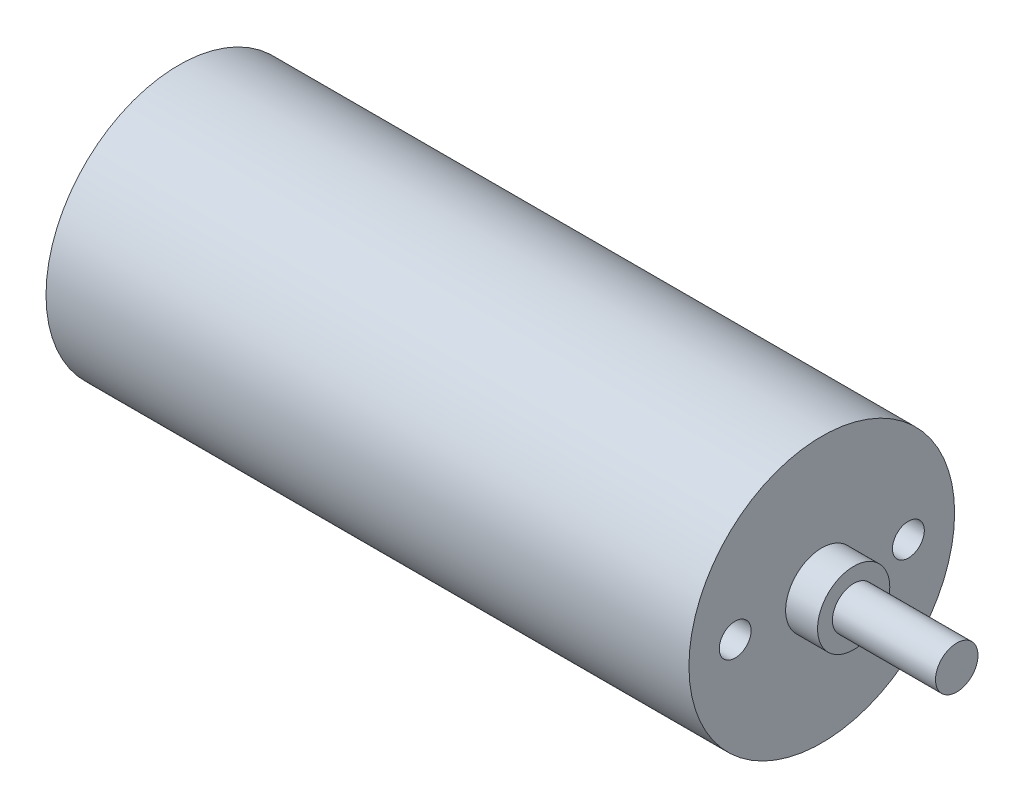
ISO-10303-21;
HEADER;
FILE_DESCRIPTION(('STEP AP214'),'2;1');
FILE_NAME('part.step','',(''),(''),'','','');
FILE_SCHEMA(('AUTOMOTIVE_DESIGN { 1 0 10303 214 1 1 1 1 }'));
ENDSEC;
DATA;
#1=APPLICATION_CONTEXT('core data for automotive mechanical design processes');
#2=APPLICATION_PROTOCOL_DEFINITION('international standard','automotive_design',2000,#1);
#3=PRODUCT_CONTEXT('',#1,'mechanical');
#4=PRODUCT('Part','Part','',(#3));
#5=PRODUCT_RELATED_PRODUCT_CATEGORY('part','',(#4));
#6=PRODUCT_DEFINITION_FORMATION('','',#4);
#7=PRODUCT_DEFINITION_CONTEXT('part definition',#1,'design');
#8=PRODUCT_DEFINITION('design','',#6,#7);
#9=PRODUCT_DEFINITION_SHAPE('','',#8);
#10=(LENGTH_UNIT() NAMED_UNIT(*) SI_UNIT(.MILLI.,.METRE.));
#11=(NAMED_UNIT(*) PLANE_ANGLE_UNIT() SI_UNIT($,.RADIAN.));
#12=(NAMED_UNIT(*) SI_UNIT($,.STERADIAN.) SOLID_ANGLE_UNIT());
#13=UNCERTAINTY_MEASURE_WITH_UNIT(LENGTH_MEASURE(1.E-05),#10,'distance_accuracy_value','');
#14=(GEOMETRIC_REPRESENTATION_CONTEXT(3) GLOBAL_UNCERTAINTY_ASSIGNED_CONTEXT((#13)) GLOBAL_UNIT_ASSIGNED_CONTEXT((#10,
#11,#12)) REPRESENTATION_CONTEXT('',''));
#15=CARTESIAN_POINT('',(0.,0.,0.));
#16=DIRECTION('',(0.,0.,1.));
#17=DIRECTION('',(1.,0.,0.));
#18=AXIS2_PLACEMENT_3D('',#15,#16,#17);
#19=CARTESIAN_POINT('',(0.,0.,0.));
#20=DIRECTION('',(-1.,0.,0.));
#21=DIRECTION('',(0.,0.,1.));
#22=AXIS2_PLACEMENT_3D('',#19,#20,#21);
#23=PLANE('',#22);
#24=CARTESIAN_POINT('',(0.,0.,0.));
#25=DIRECTION('',(1.,0.,0.));
#26=DIRECTION('',(0.,0.,-1.));
#27=AXIS2_PLACEMENT_3D('',#24,#25,#26);
#28=CIRCLE('',#27,12.5);
#29=CARTESIAN_POINT('',(0.,0.,-12.5));
#30=VERTEX_POINT('',#29);
#31=EDGE_CURVE('E10',#30,#30,#28,.T.);
#32=ORIENTED_EDGE('',*,*,#31,.F.);
#33=EDGE_LOOP('',(#32));
#34=FACE_BOUND('',#33,.T.);
#35=ADVANCED_FACE('F31',(#34),#23,.T.);
#36=CARTESIAN_POINT('',(73.2,0.,0.));
#37=DIRECTION('',(1.,0.,0.));
#38=DIRECTION('',(0.,0.,-1.));
#39=AXIS2_PLACEMENT_3D('',#36,#37,#38);
#40=CYLINDRICAL_SURFACE('',#39,12.5);
#41=ORIENTED_EDGE('',*,*,#31,.T.);
#42=EDGE_LOOP('',(#41));
#43=FACE_BOUND('',#42,.T.);
#44=CARTESIAN_POINT('',(60.5,0.,0.));
#45=DIRECTION('',(1.,0.,0.));
#46=DIRECTION('',(0.,0.,-1.));
#47=AXIS2_PLACEMENT_3D('',#44,#45,#46);
#48=CIRCLE('',#47,12.5);
#49=CARTESIAN_POINT('',(60.5,0.,-12.5));
#50=VERTEX_POINT('',#49);
#51=EDGE_CURVE('E37',#50,#50,#48,.T.);
#52=ORIENTED_EDGE('',*,*,#51,.F.);
#53=EDGE_LOOP('',(#52));
#54=FACE_BOUND('',#53,.T.);
#55=ADVANCED_FACE('F82',(#43,#54),#40,.T.);
#56=CARTESIAN_POINT('',(60.5,12.5,0.));
#57=DIRECTION('',(1.,0.,0.));
#58=DIRECTION('',(0.,0.,-1.));
#59=AXIS2_PLACEMENT_3D('',#56,#57,#58);
#60=PLANE('',#59);
#61=CARTESIAN_POINT('',(60.5,0.,8.15));
#62=DIRECTION('',(1.,0.,0.));
#63=DIRECTION('',(0.,0.,-1.));
#64=AXIS2_PLACEMENT_3D('',#61,#62,#63);
#65=CIRCLE('',#64,1.5);
#66=CARTESIAN_POINT('',(60.5,0.,6.65));
#67=VERTEX_POINT('',#66);
#68=EDGE_CURVE('E63',#67,#67,#65,.T.);
#69=ORIENTED_EDGE('',*,*,#68,.F.);
#70=EDGE_LOOP('',(#69));
#71=FACE_BOUND('',#70,.T.);
#72=CARTESIAN_POINT('',(60.5,0.,-8.15));
#73=DIRECTION('',(1.,0.,0.));
#74=DIRECTION('',(0.,0.,-1.));
#75=AXIS2_PLACEMENT_3D('',#72,#73,#74);
#76=CIRCLE('',#75,1.5);
#77=CARTESIAN_POINT('',(60.5,0.,-9.65000000000001));
#78=VERTEX_POINT('',#77);
#79=EDGE_CURVE('E57',#78,#78,#76,.T.);
#80=ORIENTED_EDGE('',*,*,#79,.F.);
#81=EDGE_LOOP('',(#80));
#82=FACE_BOUND('',#81,.T.);
#83=ORIENTED_EDGE('',*,*,#51,.T.);
#84=EDGE_LOOP('',(#83));
#85=FACE_BOUND('',#84,.T.);
#86=CARTESIAN_POINT('',(60.5,0.,0.));
#87=DIRECTION('',(1.,0.,0.));
#88=DIRECTION('',(0.,0.,-1.));
#89=AXIS2_PLACEMENT_3D('',#86,#87,#88);
#90=CIRCLE('',#89,3.400000058);
#91=CARTESIAN_POINT('',(60.5,0.,-3.400000058));
#92=VERTEX_POINT('',#91);
#93=EDGE_CURVE('E41',#92,#92,#90,.T.);
#94=ORIENTED_EDGE('',*,*,#93,.F.);
#95=EDGE_LOOP('',(#94));
#96=FACE_BOUND('',#95,.T.);
#97=ADVANCED_FACE('F78',(#71,#82,#85,#96),#60,.T.);
#98=CARTESIAN_POINT('',(73.2,0.,0.));
#99=DIRECTION('',(1.,0.,0.));
#100=DIRECTION('',(0.,0.,-1.));
#101=AXIS2_PLACEMENT_3D('',#98,#99,#100);
#102=CYLINDRICAL_SURFACE('',#101,3.400000058);
#103=ORIENTED_EDGE('',*,*,#93,.T.);
#104=EDGE_LOOP('',(#103));
#105=FACE_BOUND('',#104,.T.);
#106=CARTESIAN_POINT('',(63.5,0.,0.));
#107=DIRECTION('',(1.,0.,0.));
#108=DIRECTION('',(0.,0.,-1.));
#109=AXIS2_PLACEMENT_3D('',#106,#107,#108);
#110=CIRCLE('',#109,3.400000058);
#111=CARTESIAN_POINT('',(63.5,0.,-3.400000058));
#112=VERTEX_POINT('',#111);
#113=EDGE_CURVE('E45',#112,#112,#110,.T.);
#114=ORIENTED_EDGE('',*,*,#113,.F.);
#115=EDGE_LOOP('',(#114));
#116=FACE_BOUND('',#115,.T.);
#117=ADVANCED_FACE('F81',(#105,#116),#102,.T.);
#118=CARTESIAN_POINT('',(63.5,3.400000058,0.));
#119=DIRECTION('',(1.,0.,0.));
#120=DIRECTION('',(0.,0.,-1.));
#121=AXIS2_PLACEMENT_3D('',#118,#119,#120);
#122=PLANE('',#121);
#123=ORIENTED_EDGE('',*,*,#113,.T.);
#124=EDGE_LOOP('',(#123));
#125=FACE_BOUND('',#124,.T.);
#126=CARTESIAN_POINT('',(63.5,0.,0.));
#127=DIRECTION('',(1.,0.,0.));
#128=DIRECTION('',(0.,0.,-1.));
#129=AXIS2_PLACEMENT_3D('',#126,#127,#128);
#130=CIRCLE('',#129,2.);
#131=CARTESIAN_POINT('',(63.5,0.,-2.));
#132=VERTEX_POINT('',#131);
#133=EDGE_CURVE('E50',#132,#132,#130,.T.);
#134=ORIENTED_EDGE('',*,*,#133,.F.);
#135=EDGE_LOOP('',(#134));
#136=FACE_BOUND('',#135,.T.);
#137=ADVANCED_FACE('F90',(#125,#136),#122,.T.);
#138=CARTESIAN_POINT('',(73.2,0.,0.));
#139=DIRECTION('',(1.,0.,0.));
#140=DIRECTION('',(0.,0.,-1.));
#141=AXIS2_PLACEMENT_3D('',#138,#139,#140);
#142=CYLINDRICAL_SURFACE('',#141,2.);
#143=ORIENTED_EDGE('',*,*,#133,.T.);
#144=EDGE_LOOP('',(#143));
#145=FACE_BOUND('',#144,.T.);
#146=CARTESIAN_POINT('',(73.2,0.,0.));
#147=DIRECTION('',(1.,0.,0.));
#148=DIRECTION('',(0.,0.,-1.));
#149=AXIS2_PLACEMENT_3D('',#146,#147,#148);
#150=CIRCLE('',#149,2.);
#151=CARTESIAN_POINT('',(73.2,0.,-2.));
#152=VERTEX_POINT('',#151);
#153=EDGE_CURVE('E53',#152,#152,#150,.T.);
#154=ORIENTED_EDGE('',*,*,#153,.F.);
#155=EDGE_LOOP('',(#154));
#156=FACE_BOUND('',#155,.T.);
#157=ADVANCED_FACE('F96',(#145,#156),#142,.T.);
#158=CARTESIAN_POINT('',(73.2,2.,0.));
#159=DIRECTION('',(1.,0.,0.));
#160=DIRECTION('',(0.,0.,-1.));
#161=AXIS2_PLACEMENT_3D('',#158,#159,#160);
#162=PLANE('',#161);
#163=ORIENTED_EDGE('',*,*,#153,.T.);
#164=EDGE_LOOP('',(#163));
#165=FACE_BOUND('',#164,.T.);
#166=ADVANCED_FACE('F102',(#165),#162,.T.);
#167=CARTESIAN_POINT('',(57.5,0.,-8.15));
#168=DIRECTION('',(1.,0.,0.));
#169=DIRECTION('',(0.,0.,-1.));
#170=AXIS2_PLACEMENT_3D('',#167,#168,#169);
#171=CYLINDRICAL_SURFACE('',#170,1.5);
#172=CARTESIAN_POINT('',(57.5,0.,-8.15));
#173=DIRECTION('',(1.,0.,0.));
#174=DIRECTION('',(0.,0.,-1.));
#175=AXIS2_PLACEMENT_3D('',#172,#173,#174);
#176=CIRCLE('',#175,1.5);
#177=CARTESIAN_POINT('',(57.5,0.,-9.65000000000001));
#178=VERTEX_POINT('',#177);
#179=EDGE_CURVE('E56',#178,#178,#176,.T.);
#180=ORIENTED_EDGE('',*,*,#179,.F.);
#181=EDGE_LOOP('',(#180));
#182=FACE_BOUND('',#181,.T.);
#183=ORIENTED_EDGE('',*,*,#79,.T.);
#184=EDGE_LOOP('',(#183));
#185=FACE_BOUND('',#184,.T.);
#186=ADVANCED_FACE('F107',(#182,#185),#171,.F.);
#187=CARTESIAN_POINT('',(57.5,0.,-8.15));
#188=DIRECTION('',(1.,0.,0.));
#189=DIRECTION('',(0.,0.,-1.));
#190=AXIS2_PLACEMENT_3D('',#187,#188,#189);
#191=PLANE('',#190);
#192=ORIENTED_EDGE('',*,*,#179,.T.);
#193=EDGE_LOOP('',(#192));
#194=FACE_BOUND('',#193,.T.);
#195=ADVANCED_FACE('F74',(#194),#191,.T.);
#196=CARTESIAN_POINT('',(57.5,0.,8.15));
#197=DIRECTION('',(1.,0.,0.));
#198=DIRECTION('',(0.,0.,-1.));
#199=AXIS2_PLACEMENT_3D('',#196,#197,#198);
#200=CYLINDRICAL_SURFACE('',#199,1.5);
#201=CARTESIAN_POINT('',(57.5,0.,8.15));
#202=DIRECTION('',(1.,0.,0.));
#203=DIRECTION('',(0.,0.,-1.));
#204=AXIS2_PLACEMENT_3D('',#201,#202,#203);
#205=CIRCLE('',#204,1.5);
#206=CARTESIAN_POINT('',(57.5,0.,6.65));
#207=VERTEX_POINT('',#206);
#208=EDGE_CURVE('E60',#207,#207,#205,.T.);
#209=ORIENTED_EDGE('',*,*,#208,.F.);
#210=EDGE_LOOP('',(#209));
#211=FACE_BOUND('',#210,.T.);
#212=ORIENTED_EDGE('',*,*,#68,.T.);
#213=EDGE_LOOP('',(#212));
#214=FACE_BOUND('',#213,.T.);
#215=ADVANCED_FACE('F71',(#211,#214),#200,.F.);
#216=CARTESIAN_POINT('',(57.5,0.,8.15));
#217=DIRECTION('',(1.,0.,0.));
#218=DIRECTION('',(0.,0.,-1.));
#219=AXIS2_PLACEMENT_3D('',#216,#217,#218);
#220=PLANE('',#219);
#221=ORIENTED_EDGE('',*,*,#208,.T.);
#222=EDGE_LOOP('',(#221));
#223=FACE_BOUND('',#222,.T.);
#224=ADVANCED_FACE('F69',(#223),#220,.T.);
#225=CLOSED_SHELL('',(#35,#55,#97,#117,#137,#157,#166,#186,#195,#215,#224));
#226=MANIFOLD_SOLID_BREP('B2',#225);
#227=ADVANCED_BREP_SHAPE_REPRESENTATION('',(#18,#226),#14);
#228=SHAPE_DEFINITION_REPRESENTATION(#9,#227);
ENDSEC;
END-ISO-10303-21;
